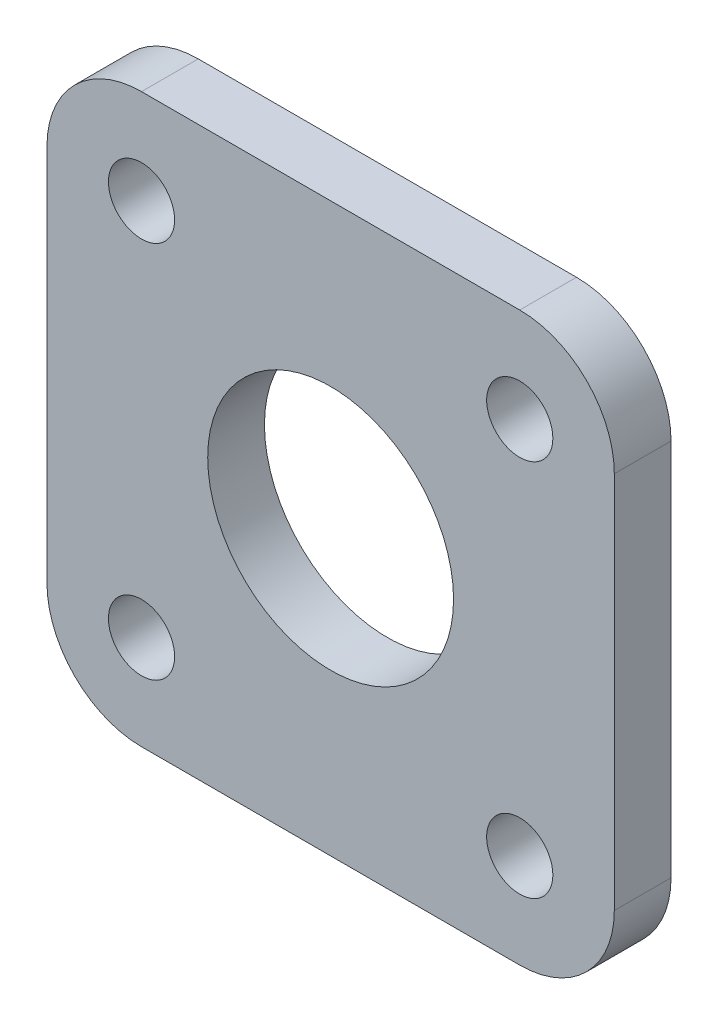
ISO-10303-21;
HEADER;
FILE_DESCRIPTION(('STEP AP214'),'2;1');
FILE_NAME('part.step','',(''),(''),'','','');
FILE_SCHEMA(('AUTOMOTIVE_DESIGN { 1 0 10303 214 1 1 1 1 }'));
ENDSEC;
DATA;
#1=APPLICATION_CONTEXT('core data for automotive mechanical design processes');
#2=APPLICATION_PROTOCOL_DEFINITION('international standard','automotive_design',2000,#1);
#3=PRODUCT_CONTEXT('',#1,'mechanical');
#4=PRODUCT('Part','Part','',(#3));
#5=PRODUCT_RELATED_PRODUCT_CATEGORY('part','',(#4));
#6=PRODUCT_DEFINITION_FORMATION('','',#4);
#7=PRODUCT_DEFINITION_CONTEXT('part definition',#1,'design');
#8=PRODUCT_DEFINITION('design','',#6,#7);
#9=PRODUCT_DEFINITION_SHAPE('','',#8);
#10=(LENGTH_UNIT() NAMED_UNIT(*) SI_UNIT(.MILLI.,.METRE.));
#11=(NAMED_UNIT(*) PLANE_ANGLE_UNIT() SI_UNIT($,.RADIAN.));
#12=(NAMED_UNIT(*) SI_UNIT($,.STERADIAN.) SOLID_ANGLE_UNIT());
#13=UNCERTAINTY_MEASURE_WITH_UNIT(LENGTH_MEASURE(1.E-05),#10,'distance_accuracy_value','');
#14=(GEOMETRIC_REPRESENTATION_CONTEXT(3) GLOBAL_UNCERTAINTY_ASSIGNED_CONTEXT((#13)) GLOBAL_UNIT_ASSIGNED_CONTEXT((#10,
#11,#12)) REPRESENTATION_CONTEXT('',''));
#15=CARTESIAN_POINT('',(0.,0.,0.));
#16=DIRECTION('',(0.,0.,1.));
#17=DIRECTION('',(1.,0.,0.));
#18=AXIS2_PLACEMENT_3D('',#15,#16,#17);
#19=CARTESIAN_POINT('',(-9.99999999999999,-10.,3.));
#20=DIRECTION('',(0.,0.,1.));
#21=DIRECTION('',(1.,0.,0.));
#22=AXIS2_PLACEMENT_3D('',#19,#20,#21);
#23=PLANE('',#22);
#24=CARTESIAN_POINT('',(10.,-10.,3.));
#25=DIRECTION('',(0.,0.,1.));
#26=DIRECTION('',(1.,0.,0.));
#27=AXIS2_PLACEMENT_3D('',#24,#25,#26);
#28=CIRCLE('',#27,1.75);
#29=CARTESIAN_POINT('',(11.75,-10.,3.));
#30=VERTEX_POINT('',#29);
#31=EDGE_CURVE('E229',#30,#30,#28,.T.);
#32=ORIENTED_EDGE('',*,*,#31,.F.);
#33=EDGE_LOOP('',(#32));
#34=FACE_BOUND('',#33,.T.);
#35=CARTESIAN_POINT('',(-10.,10.,3.));
#36=DIRECTION('',(0.,0.,1.));
#37=DIRECTION('',(1.,0.,0.));
#38=AXIS2_PLACEMENT_3D('',#35,#36,#37);
#39=CIRCLE('',#38,1.75);
#40=CARTESIAN_POINT('',(-8.25,10.,3.));
#41=VERTEX_POINT('',#40);
#42=EDGE_CURVE('E213',#41,#41,#39,.T.);
#43=ORIENTED_EDGE('',*,*,#42,.F.);
#44=EDGE_LOOP('',(#43));
#45=FACE_BOUND('',#44,.T.);
#46=CARTESIAN_POINT('',(-9.99999999999999,-10.,3.));
#47=DIRECTION('',(0.,0.,1.));
#48=DIRECTION('',(1.,0.,0.));
#49=AXIS2_PLACEMENT_3D('',#46,#47,#48);
#50=CIRCLE('',#49,5.);
#51=CARTESIAN_POINT('',(-15.,-9.99999999999997,3.));
#52=VERTEX_POINT('',#51);
#53=CARTESIAN_POINT('',(-9.99999999999996,-15.,3.));
#54=VERTEX_POINT('',#53);
#55=EDGE_CURVE('E164',#52,#54,#50,.T.);
#56=ORIENTED_EDGE('',*,*,#55,.T.);
#57=DIRECTION('',(1.,0.,0.));
#58=VECTOR('',#57,1.);
#59=CARTESIAN_POINT('',(-9.99999999999996,-15.,3.));
#60=LINE('',#59,#58);
#61=CARTESIAN_POINT('',(9.99999999999997,-15.,3.));
#62=VERTEX_POINT('',#61);
#63=EDGE_CURVE('E100',#54,#62,#60,.T.);
#64=ORIENTED_EDGE('',*,*,#63,.T.);
#65=CARTESIAN_POINT('',(10.,-10.,3.));
#66=DIRECTION('',(0.,0.,1.));
#67=DIRECTION('',(1.,0.,0.));
#68=AXIS2_PLACEMENT_3D('',#65,#66,#67);
#69=CIRCLE('',#68,5.);
#70=CARTESIAN_POINT('',(15.,-9.99999999999997,3.));
#71=VERTEX_POINT('',#70);
#72=EDGE_CURVE('E185',#62,#71,#69,.T.);
#73=ORIENTED_EDGE('',*,*,#72,.T.);
#74=DIRECTION('',(0.,1.,0.));
#75=VECTOR('',#74,1.);
#76=CARTESIAN_POINT('',(15.,9.99999999999996,3.));
#77=LINE('',#76,#75);
#78=CARTESIAN_POINT('',(15.,9.99999999999996,3.));
#79=VERTEX_POINT('',#78);
#80=EDGE_CURVE('E199',#71,#79,#77,.T.);
#81=ORIENTED_EDGE('',*,*,#80,.T.);
#82=CARTESIAN_POINT('',(10.,9.99999999999999,3.));
#83=DIRECTION('',(0.,0.,1.));
#84=DIRECTION('',(1.,0.,0.));
#85=AXIS2_PLACEMENT_3D('',#82,#83,#84);
#86=CIRCLE('',#85,5.);
#87=CARTESIAN_POINT('',(9.99999999999996,15.,3.));
#88=VERTEX_POINT('',#87);
#89=EDGE_CURVE('E119',#79,#88,#86,.T.);
#90=ORIENTED_EDGE('',*,*,#89,.T.);
#91=DIRECTION('',(-1.,0.,0.));
#92=VECTOR('',#91,1.);
#93=CARTESIAN_POINT('',(-9.99999999999996,15.,3.));
#94=LINE('',#93,#92);
#95=CARTESIAN_POINT('',(-9.99999999999996,15.,3.));
#96=VERTEX_POINT('',#95);
#97=EDGE_CURVE('E113',#88,#96,#94,.T.);
#98=ORIENTED_EDGE('',*,*,#97,.T.);
#99=CARTESIAN_POINT('',(-10.,10.,3.));
#100=DIRECTION('',(0.,0.,1.));
#101=DIRECTION('',(1.,0.,0.));
#102=AXIS2_PLACEMENT_3D('',#99,#100,#101);
#103=CIRCLE('',#102,5.);
#104=CARTESIAN_POINT('',(-15.,9.99999999999996,3.));
#105=VERTEX_POINT('',#104);
#106=EDGE_CURVE('E117',#96,#105,#103,.T.);
#107=ORIENTED_EDGE('',*,*,#106,.T.);
#108=DIRECTION('',(0.,-1.,0.));
#109=VECTOR('',#108,1.);
#110=CARTESIAN_POINT('',(-15.,9.99999999999996,3.));
#111=LINE('',#110,#109);
#112=EDGE_CURVE('E57',#105,#52,#111,.T.);
#113=ORIENTED_EDGE('',*,*,#112,.T.);
#114=EDGE_LOOP('',(#56,#64,#73,#81,#90,#98,#107,#113));
#115=FACE_BOUND('',#114,.T.);
#116=CARTESIAN_POINT('',(0.,0.,3.));
#117=DIRECTION('',(0.,0.,1.));
#118=DIRECTION('',(1.,0.,0.));
#119=AXIS2_PLACEMENT_3D('',#116,#117,#118);
#120=CIRCLE('',#119,6.5);
#121=CARTESIAN_POINT('',(6.5,0.,3.));
#122=VERTEX_POINT('',#121);
#123=EDGE_CURVE('E146',#122,#122,#120,.T.);
#124=ORIENTED_EDGE('',*,*,#123,.F.);
#125=EDGE_LOOP('',(#124));
#126=FACE_BOUND('',#125,.T.);
#127=CARTESIAN_POINT('',(10.,10.,3.));
#128=DIRECTION('',(0.,0.,1.));
#129=DIRECTION('',(1.,0.,0.));
#130=AXIS2_PLACEMENT_3D('',#127,#128,#129);
#131=CIRCLE('',#130,1.75);
#132=CARTESIAN_POINT('',(11.75,10.,3.));
#133=VERTEX_POINT('',#132);
#134=EDGE_CURVE('E221',#133,#133,#131,.T.);
#135=ORIENTED_EDGE('',*,*,#134,.F.);
#136=EDGE_LOOP('',(#135));
#137=FACE_BOUND('',#136,.T.);
#138=CARTESIAN_POINT('',(-10.,-10.,3.));
#139=DIRECTION('',(0.,0.,1.));
#140=DIRECTION('',(1.,0.,0.));
#141=AXIS2_PLACEMENT_3D('',#138,#139,#140);
#142=CIRCLE('',#141,1.75);
#143=CARTESIAN_POINT('',(-8.25,-10.,3.));
#144=VERTEX_POINT('',#143);
#145=EDGE_CURVE('E237',#144,#144,#142,.T.);
#146=ORIENTED_EDGE('',*,*,#145,.F.);
#147=EDGE_LOOP('',(#146));
#148=FACE_BOUND('',#147,.T.);
#149=ADVANCED_FACE('F39',(#34,#45,#115,#126,#137,#148),#23,.T.);
#150=CARTESIAN_POINT('',(-9.99999999999999,-10.,0.));
#151=DIRECTION('',(0.,0.,1.));
#152=DIRECTION('',(1.,0.,0.));
#153=AXIS2_PLACEMENT_3D('',#150,#151,#152);
#154=PLANE('',#153);
#155=CARTESIAN_POINT('',(-9.99999999999999,-10.,0.));
#156=DIRECTION('',(0.,0.,1.));
#157=DIRECTION('',(1.,0.,0.));
#158=AXIS2_PLACEMENT_3D('',#155,#156,#157);
#159=CIRCLE('',#158,5.);
#160=CARTESIAN_POINT('',(-15.,-9.99999999999997,0.));
#161=VERTEX_POINT('',#160);
#162=CARTESIAN_POINT('',(-9.99999999999996,-15.,0.));
#163=VERTEX_POINT('',#162);
#164=EDGE_CURVE('E141',#161,#163,#159,.T.);
#165=ORIENTED_EDGE('',*,*,#164,.F.);
#166=DIRECTION('',(0.,-1.,0.));
#167=VECTOR('',#166,1.);
#168=CARTESIAN_POINT('',(-15.,9.99999999999996,0.));
#169=LINE('',#168,#167);
#170=CARTESIAN_POINT('',(-15.,9.99999999999996,0.));
#171=VERTEX_POINT('',#170);
#172=EDGE_CURVE('E92',#171,#161,#169,.T.);
#173=ORIENTED_EDGE('',*,*,#172,.F.);
#174=CARTESIAN_POINT('',(-10.,10.,0.));
#175=DIRECTION('',(0.,0.,1.));
#176=DIRECTION('',(1.,0.,0.));
#177=AXIS2_PLACEMENT_3D('',#174,#175,#176);
#178=CIRCLE('',#177,5.);
#179=CARTESIAN_POINT('',(-9.99999999999996,15.,0.));
#180=VERTEX_POINT('',#179);
#181=EDGE_CURVE('E86',#180,#171,#178,.T.);
#182=ORIENTED_EDGE('',*,*,#181,.F.);
#183=DIRECTION('',(-1.,0.,0.));
#184=VECTOR('',#183,1.);
#185=CARTESIAN_POINT('',(-9.99999999999996,15.,0.));
#186=LINE('',#185,#184);
#187=CARTESIAN_POINT('',(9.99999999999996,15.,0.));
#188=VERTEX_POINT('',#187);
#189=EDGE_CURVE('E128',#188,#180,#186,.T.);
#190=ORIENTED_EDGE('',*,*,#189,.F.);
#191=CARTESIAN_POINT('',(10.,9.99999999999999,0.));
#192=DIRECTION('',(0.,0.,1.));
#193=DIRECTION('',(1.,0.,0.));
#194=AXIS2_PLACEMENT_3D('',#191,#192,#193);
#195=CIRCLE('',#194,5.);
#196=CARTESIAN_POINT('',(15.,9.99999999999996,0.));
#197=VERTEX_POINT('',#196);
#198=EDGE_CURVE('E155',#197,#188,#195,.T.);
#199=ORIENTED_EDGE('',*,*,#198,.F.);
#200=DIRECTION('',(0.,1.,0.));
#201=VECTOR('',#200,1.);
#202=CARTESIAN_POINT('',(15.,9.99999999999996,0.));
#203=LINE('',#202,#201);
#204=CARTESIAN_POINT('',(15.,-9.99999999999997,0.));
#205=VERTEX_POINT('',#204);
#206=EDGE_CURVE('E152',#205,#197,#203,.T.);
#207=ORIENTED_EDGE('',*,*,#206,.F.);
#208=CARTESIAN_POINT('',(10.,-10.,0.));
#209=DIRECTION('',(0.,0.,1.));
#210=DIRECTION('',(1.,0.,0.));
#211=AXIS2_PLACEMENT_3D('',#208,#209,#210);
#212=CIRCLE('',#211,5.);
#213=CARTESIAN_POINT('',(9.99999999999997,-15.,0.));
#214=VERTEX_POINT('',#213);
#215=EDGE_CURVE('E149',#214,#205,#212,.T.);
#216=ORIENTED_EDGE('',*,*,#215,.F.);
#217=DIRECTION('',(1.,0.,0.));
#218=VECTOR('',#217,1.);
#219=CARTESIAN_POINT('',(-9.99999999999996,-15.,0.));
#220=LINE('',#219,#218);
#221=EDGE_CURVE('E145',#163,#214,#220,.T.);
#222=ORIENTED_EDGE('',*,*,#221,.F.);
#223=EDGE_LOOP('',(#165,#173,#182,#190,#199,#207,#216,#222));
#224=FACE_BOUND('',#223,.T.);
#225=CARTESIAN_POINT('',(0.,0.,0.));
#226=DIRECTION('',(0.,0.,1.));
#227=DIRECTION('',(1.,0.,0.));
#228=AXIS2_PLACEMENT_3D('',#225,#226,#227);
#229=CIRCLE('',#228,6.5);
#230=CARTESIAN_POINT('',(6.5,0.,0.));
#231=VERTEX_POINT('',#230);
#232=EDGE_CURVE('E209',#231,#231,#229,.T.);
#233=ORIENTED_EDGE('',*,*,#232,.T.);
#234=EDGE_LOOP('',(#233));
#235=FACE_BOUND('',#234,.T.);
#236=CARTESIAN_POINT('',(-10.,10.,0.));
#237=DIRECTION('',(0.,0.,1.));
#238=DIRECTION('',(1.,0.,0.));
#239=AXIS2_PLACEMENT_3D('',#236,#237,#238);
#240=CIRCLE('',#239,1.75);
#241=CARTESIAN_POINT('',(-8.25,10.,0.));
#242=VERTEX_POINT('',#241);
#243=EDGE_CURVE('E217',#242,#242,#240,.T.);
#244=ORIENTED_EDGE('',*,*,#243,.T.);
#245=EDGE_LOOP('',(#244));
#246=FACE_BOUND('',#245,.T.);
#247=CARTESIAN_POINT('',(10.,10.,0.));
#248=DIRECTION('',(0.,0.,1.));
#249=DIRECTION('',(1.,0.,0.));
#250=AXIS2_PLACEMENT_3D('',#247,#248,#249);
#251=CIRCLE('',#250,1.75);
#252=CARTESIAN_POINT('',(11.75,10.,0.));
#253=VERTEX_POINT('',#252);
#254=EDGE_CURVE('E225',#253,#253,#251,.T.);
#255=ORIENTED_EDGE('',*,*,#254,.T.);
#256=EDGE_LOOP('',(#255));
#257=FACE_BOUND('',#256,.T.);
#258=CARTESIAN_POINT('',(10.,-10.,0.));
#259=DIRECTION('',(0.,0.,1.));
#260=DIRECTION('',(1.,0.,0.));
#261=AXIS2_PLACEMENT_3D('',#258,#259,#260);
#262=CIRCLE('',#261,1.75);
#263=CARTESIAN_POINT('',(11.75,-10.,0.));
#264=VERTEX_POINT('',#263);
#265=EDGE_CURVE('E233',#264,#264,#262,.T.);
#266=ORIENTED_EDGE('',*,*,#265,.T.);
#267=EDGE_LOOP('',(#266));
#268=FACE_BOUND('',#267,.T.);
#269=CARTESIAN_POINT('',(-10.,-10.,0.));
#270=DIRECTION('',(0.,0.,1.));
#271=DIRECTION('',(1.,0.,0.));
#272=AXIS2_PLACEMENT_3D('',#269,#270,#271);
#273=CIRCLE('',#272,1.75);
#274=CARTESIAN_POINT('',(-8.25,-10.,0.));
#275=VERTEX_POINT('',#274);
#276=EDGE_CURVE('E241',#275,#275,#273,.T.);
#277=ORIENTED_EDGE('',*,*,#276,.T.);
#278=EDGE_LOOP('',(#277));
#279=FACE_BOUND('',#278,.T.);
#280=ADVANCED_FACE('F189',(#224,#235,#246,#257,#268,#279),#154,.F.);
#281=CARTESIAN_POINT('',(-9.99999999999999,-10.,3.));
#282=DIRECTION('',(0.,0.,-1.));
#283=DIRECTION('',(-1.,0.,0.));
#284=AXIS2_PLACEMENT_3D('',#281,#282,#283);
#285=CYLINDRICAL_SURFACE('',#284,5.);
#286=ORIENTED_EDGE('',*,*,#164,.T.);
#287=DIRECTION('',(0.,0.,-1.));
#288=VECTOR('',#287,1.);
#289=CARTESIAN_POINT('',(-9.99999999999996,-15.,3.));
#290=LINE('',#289,#288);
#291=EDGE_CURVE('E11',#54,#163,#290,.T.);
#292=ORIENTED_EDGE('',*,*,#291,.F.);
#293=ORIENTED_EDGE('',*,*,#55,.F.);
#294=DIRECTION('',(0.,0.,-1.));
#295=VECTOR('',#294,1.);
#296=CARTESIAN_POINT('',(-15.,-9.99999999999997,3.));
#297=LINE('',#296,#295);
#298=EDGE_CURVE('E137',#52,#161,#297,.T.);
#299=ORIENTED_EDGE('',*,*,#298,.T.);
#300=EDGE_LOOP('',(#286,#292,#293,#299));
#301=FACE_BOUND('',#300,.T.);
#302=ADVANCED_FACE('F41',(#301),#285,.T.);
#303=CARTESIAN_POINT('',(-9.99999999999996,-15.,3.));
#304=DIRECTION('',(0.,1.,0.));
#305=DIRECTION('',(0.,0.,1.));
#306=AXIS2_PLACEMENT_3D('',#303,#304,#305);
#307=PLANE('',#306);
#308=ORIENTED_EDGE('',*,*,#221,.T.);
#309=DIRECTION('',(0.,0.,-1.));
#310=VECTOR('',#309,1.);
#311=CARTESIAN_POINT('',(9.99999999999997,-15.,3.));
#312=LINE('',#311,#310);
#313=EDGE_CURVE('E49',#62,#214,#312,.T.);
#314=ORIENTED_EDGE('',*,*,#313,.F.);
#315=ORIENTED_EDGE('',*,*,#63,.F.);
#316=ORIENTED_EDGE('',*,*,#291,.T.);
#317=EDGE_LOOP('',(#308,#314,#315,#316));
#318=FACE_BOUND('',#317,.T.);
#319=ADVANCED_FACE('F277',(#318),#307,.F.);
#320=CARTESIAN_POINT('',(10.,-10.,3.));
#321=DIRECTION('',(0.,0.,-1.));
#322=DIRECTION('',(-1.,0.,0.));
#323=AXIS2_PLACEMENT_3D('',#320,#321,#322);
#324=CYLINDRICAL_SURFACE('',#323,5.);
#325=ORIENTED_EDGE('',*,*,#215,.T.);
#326=DIRECTION('',(0.,0.,-1.));
#327=VECTOR('',#326,1.);
#328=CARTESIAN_POINT('',(15.,-9.99999999999997,3.));
#329=LINE('',#328,#327);
#330=EDGE_CURVE('E175',#71,#205,#329,.T.);
#331=ORIENTED_EDGE('',*,*,#330,.F.);
#332=ORIENTED_EDGE('',*,*,#72,.F.);
#333=ORIENTED_EDGE('',*,*,#313,.T.);
#334=EDGE_LOOP('',(#325,#331,#332,#333));
#335=FACE_BOUND('',#334,.T.);
#336=ADVANCED_FACE('F183',(#335),#324,.T.);
#337=CARTESIAN_POINT('',(15.,9.99999999999996,3.));
#338=DIRECTION('',(-1.,0.,0.));
#339=DIRECTION('',(0.,-1.,0.));
#340=AXIS2_PLACEMENT_3D('',#337,#338,#339);
#341=PLANE('',#340);
#342=ORIENTED_EDGE('',*,*,#206,.T.);
#343=DIRECTION('',(0.,0.,-1.));
#344=VECTOR('',#343,1.);
#345=CARTESIAN_POINT('',(15.,9.99999999999996,3.));
#346=LINE('',#345,#344);
#347=EDGE_CURVE('E171',#79,#197,#346,.T.);
#348=ORIENTED_EDGE('',*,*,#347,.F.);
#349=ORIENTED_EDGE('',*,*,#80,.F.);
#350=ORIENTED_EDGE('',*,*,#330,.T.);
#351=EDGE_LOOP('',(#342,#348,#349,#350));
#352=FACE_BOUND('',#351,.T.);
#353=ADVANCED_FACE('F194',(#352),#341,.F.);
#354=CARTESIAN_POINT('',(10.,9.99999999999999,3.));
#355=DIRECTION('',(0.,0.,-1.));
#356=DIRECTION('',(-1.,0.,0.));
#357=AXIS2_PLACEMENT_3D('',#354,#355,#356);
#358=CYLINDRICAL_SURFACE('',#357,5.);
#359=ORIENTED_EDGE('',*,*,#198,.T.);
#360=DIRECTION('',(0.,0.,-1.));
#361=VECTOR('',#360,1.);
#362=CARTESIAN_POINT('',(9.99999999999996,15.,3.));
#363=LINE('',#362,#361);
#364=EDGE_CURVE('E130',#88,#188,#363,.T.);
#365=ORIENTED_EDGE('',*,*,#364,.F.);
#366=ORIENTED_EDGE('',*,*,#89,.F.);
#367=ORIENTED_EDGE('',*,*,#347,.T.);
#368=EDGE_LOOP('',(#359,#365,#366,#367));
#369=FACE_BOUND('',#368,.T.);
#370=ADVANCED_FACE('F197',(#369),#358,.T.);
#371=CARTESIAN_POINT('',(-9.99999999999996,15.,3.));
#372=DIRECTION('',(0.,-1.,0.));
#373=DIRECTION('',(0.,0.,-1.));
#374=AXIS2_PLACEMENT_3D('',#371,#372,#373);
#375=PLANE('',#374);
#376=ORIENTED_EDGE('',*,*,#189,.T.);
#377=DIRECTION('',(0.,0.,-1.));
#378=VECTOR('',#377,1.);
#379=CARTESIAN_POINT('',(-9.99999999999996,15.,3.));
#380=LINE('',#379,#378);
#381=EDGE_CURVE('E125',#96,#180,#380,.T.);
#382=ORIENTED_EDGE('',*,*,#381,.F.);
#383=ORIENTED_EDGE('',*,*,#97,.F.);
#384=ORIENTED_EDGE('',*,*,#364,.T.);
#385=EDGE_LOOP('',(#376,#382,#383,#384));
#386=FACE_BOUND('',#385,.T.);
#387=ADVANCED_FACE('F126',(#386),#375,.F.);
#388=CARTESIAN_POINT('',(-10.,10.,3.));
#389=DIRECTION('',(0.,0.,-1.));
#390=DIRECTION('',(-1.,0.,0.));
#391=AXIS2_PLACEMENT_3D('',#388,#389,#390);
#392=CYLINDRICAL_SURFACE('',#391,5.);
#393=ORIENTED_EDGE('',*,*,#181,.T.);
#394=DIRECTION('',(0.,0.,-1.));
#395=VECTOR('',#394,1.);
#396=CARTESIAN_POINT('',(-15.,9.99999999999996,3.));
#397=LINE('',#396,#395);
#398=EDGE_CURVE('E131',#105,#171,#397,.T.);
#399=ORIENTED_EDGE('',*,*,#398,.F.);
#400=ORIENTED_EDGE('',*,*,#106,.F.);
#401=ORIENTED_EDGE('',*,*,#381,.T.);
#402=EDGE_LOOP('',(#393,#399,#400,#401));
#403=FACE_BOUND('',#402,.T.);
#404=ADVANCED_FACE('F133',(#403),#392,.T.);
#405=CARTESIAN_POINT('',(-15.,9.99999999999996,3.));
#406=DIRECTION('',(1.,0.,0.));
#407=DIRECTION('',(0.,1.,0.));
#408=AXIS2_PLACEMENT_3D('',#405,#406,#407);
#409=PLANE('',#408);
#410=ORIENTED_EDGE('',*,*,#172,.T.);
#411=ORIENTED_EDGE('',*,*,#298,.F.);
#412=ORIENTED_EDGE('',*,*,#112,.F.);
#413=ORIENTED_EDGE('',*,*,#398,.T.);
#414=EDGE_LOOP('',(#410,#411,#412,#413));
#415=FACE_BOUND('',#414,.T.);
#416=ADVANCED_FACE('F265',(#415),#409,.F.);
#417=CARTESIAN_POINT('',(0.,0.,3.));
#418=DIRECTION('',(0.,0.,-1.));
#419=DIRECTION('',(-1.,0.,0.));
#420=AXIS2_PLACEMENT_3D('',#417,#418,#419);
#421=CYLINDRICAL_SURFACE('',#420,6.5);
#422=ORIENTED_EDGE('',*,*,#123,.T.);
#423=EDGE_LOOP('',(#422));
#424=FACE_BOUND('',#423,.T.);
#425=ORIENTED_EDGE('',*,*,#232,.F.);
#426=EDGE_LOOP('',(#425));
#427=FACE_BOUND('',#426,.T.);
#428=ADVANCED_FACE('F262',(#424,#427),#421,.F.);
#429=CARTESIAN_POINT('',(-10.,10.,3.));
#430=DIRECTION('',(0.,0.,-1.));
#431=DIRECTION('',(-1.,0.,0.));
#432=AXIS2_PLACEMENT_3D('',#429,#430,#431);
#433=CYLINDRICAL_SURFACE('',#432,1.75);
#434=ORIENTED_EDGE('',*,*,#42,.T.);
#435=EDGE_LOOP('',(#434));
#436=FACE_BOUND('',#435,.T.);
#437=ORIENTED_EDGE('',*,*,#243,.F.);
#438=EDGE_LOOP('',(#437));
#439=FACE_BOUND('',#438,.T.);
#440=ADVANCED_FACE('F341',(#436,#439),#433,.F.);
#441=CARTESIAN_POINT('',(10.,10.,3.));
#442=DIRECTION('',(0.,0.,-1.));
#443=DIRECTION('',(-1.,0.,0.));
#444=AXIS2_PLACEMENT_3D('',#441,#442,#443);
#445=CYLINDRICAL_SURFACE('',#444,1.75);
#446=ORIENTED_EDGE('',*,*,#134,.T.);
#447=EDGE_LOOP('',(#446));
#448=FACE_BOUND('',#447,.T.);
#449=ORIENTED_EDGE('',*,*,#254,.F.);
#450=EDGE_LOOP('',(#449));
#451=FACE_BOUND('',#450,.T.);
#452=ADVANCED_FACE('F349',(#448,#451),#445,.F.);
#453=CARTESIAN_POINT('',(10.,-10.,3.));
#454=DIRECTION('',(0.,0.,-1.));
#455=DIRECTION('',(-1.,0.,0.));
#456=AXIS2_PLACEMENT_3D('',#453,#454,#455);
#457=CYLINDRICAL_SURFACE('',#456,1.75);
#458=ORIENTED_EDGE('',*,*,#31,.T.);
#459=EDGE_LOOP('',(#458));
#460=FACE_BOUND('',#459,.T.);
#461=ORIENTED_EDGE('',*,*,#265,.F.);
#462=EDGE_LOOP('',(#461));
#463=FACE_BOUND('',#462,.T.);
#464=ADVANCED_FACE('F357',(#460,#463),#457,.F.);
#465=CARTESIAN_POINT('',(-10.,-10.,3.));
#466=DIRECTION('',(0.,0.,-1.));
#467=DIRECTION('',(-1.,0.,0.));
#468=AXIS2_PLACEMENT_3D('',#465,#466,#467);
#469=CYLINDRICAL_SURFACE('',#468,1.75);
#470=ORIENTED_EDGE('',*,*,#145,.T.);
#471=EDGE_LOOP('',(#470));
#472=FACE_BOUND('',#471,.T.);
#473=ORIENTED_EDGE('',*,*,#276,.F.);
#474=EDGE_LOOP('',(#473));
#475=FACE_BOUND('',#474,.T.);
#476=ADVANCED_FACE('F249',(#472,#475),#469,.F.);
#477=CLOSED_SHELL('',(#149,#280,#302,#319,#336,#353,#370,#387,#404,#416,#428,#440,#452,#464,#476));
#478=MANIFOLD_SOLID_BREP('B2',#477);
#479=ADVANCED_BREP_SHAPE_REPRESENTATION('',(#18,#478),#14);
#480=SHAPE_DEFINITION_REPRESENTATION(#9,#479);
ENDSEC;
END-ISO-10303-21;
